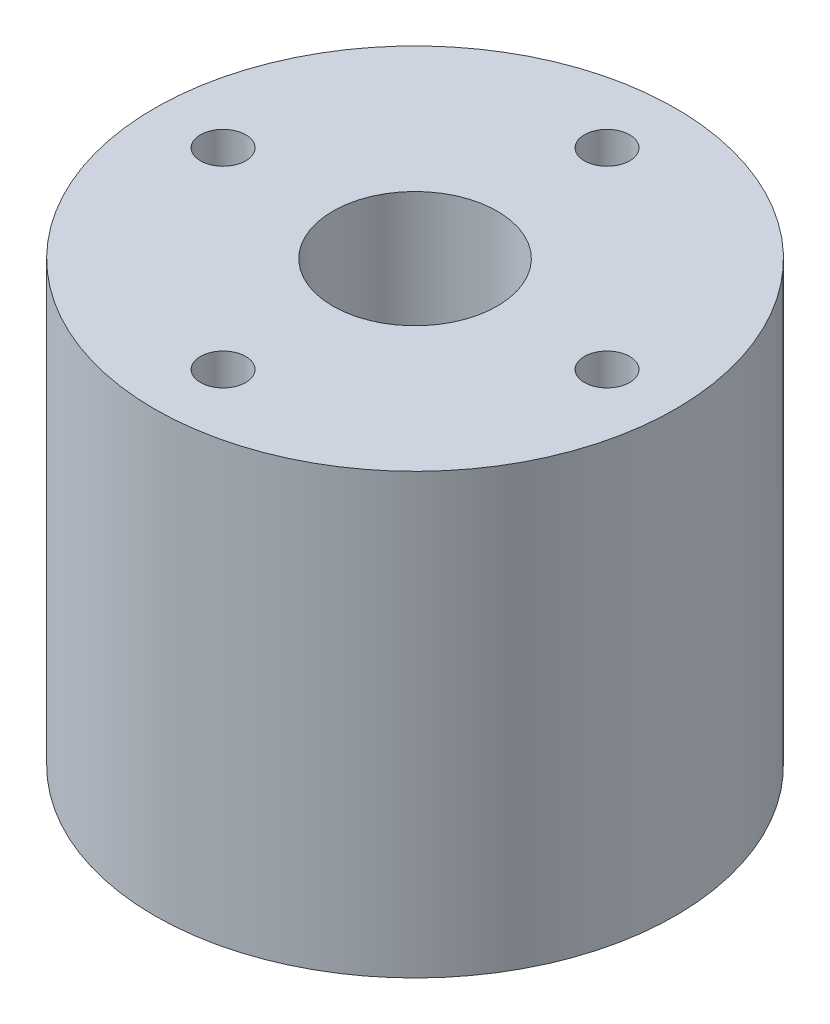
ISO-10303-21;
HEADER;
FILE_DESCRIPTION(('STEP AP214'),'2;1');
FILE_NAME('part.step','',(''),(''),'','','');
FILE_SCHEMA(('AUTOMOTIVE_DESIGN { 1 0 10303 214 1 1 1 1 }'));
ENDSEC;
DATA;
#1=APPLICATION_CONTEXT('core data for automotive mechanical design processes');
#2=APPLICATION_PROTOCOL_DEFINITION('international standard','automotive_design',2000,#1);
#3=PRODUCT_CONTEXT('',#1,'mechanical');
#4=PRODUCT('Part','Part','',(#3));
#5=PRODUCT_RELATED_PRODUCT_CATEGORY('part','',(#4));
#6=PRODUCT_DEFINITION_FORMATION('','',#4);
#7=PRODUCT_DEFINITION_CONTEXT('part definition',#1,'design');
#8=PRODUCT_DEFINITION('design','',#6,#7);
#9=PRODUCT_DEFINITION_SHAPE('','',#8);
#10=(LENGTH_UNIT() NAMED_UNIT(*) SI_UNIT(.MILLI.,.METRE.));
#11=(NAMED_UNIT(*) PLANE_ANGLE_UNIT() SI_UNIT($,.RADIAN.));
#12=(NAMED_UNIT(*) SI_UNIT($,.STERADIAN.) SOLID_ANGLE_UNIT());
#13=UNCERTAINTY_MEASURE_WITH_UNIT(LENGTH_MEASURE(1.E-05),#10,'distance_accuracy_value','');
#14=(GEOMETRIC_REPRESENTATION_CONTEXT(3) GLOBAL_UNCERTAINTY_ASSIGNED_CONTEXT((#13)) GLOBAL_UNIT_ASSIGNED_CONTEXT((#10,
#11,#12)) REPRESENTATION_CONTEXT('',''));
#15=CARTESIAN_POINT('',(0.,0.,0.));
#16=DIRECTION('',(0.,0.,1.));
#17=DIRECTION('',(1.,0.,0.));
#18=AXIS2_PLACEMENT_3D('',#15,#16,#17);
#19=CARTESIAN_POINT('',(0.,32.,0.));
#20=DIRECTION('',(0.,1.,0.));
#21=DIRECTION('',(0.,0.,1.));
#22=AXIS2_PLACEMENT_3D('',#19,#20,#21);
#23=PLANE('',#22);
#24=CARTESIAN_POINT('',(-14.,32.,0.));
#25=DIRECTION('',(0.,1.,0.));
#26=DIRECTION('',(0.,0.,1.));
#27=AXIS2_PLACEMENT_3D('',#24,#25,#26);
#28=CIRCLE('',#27,1.64999999999999);
#29=CARTESIAN_POINT('',(-14.,32.,1.64999999999999));
#30=VERTEX_POINT('',#29);
#31=EDGE_CURVE('E109',#30,#30,#28,.T.);
#32=ORIENTED_EDGE('',*,*,#31,.F.);
#33=EDGE_LOOP('',(#32));
#34=FACE_BOUND('',#33,.T.);
#35=CARTESIAN_POINT('',(0.,32.,14.));
#36=DIRECTION('',(0.,1.,0.));
#37=DIRECTION('',(0.,0.,1.));
#38=AXIS2_PLACEMENT_3D('',#35,#36,#37);
#39=CIRCLE('',#38,1.64999999999999);
#40=CARTESIAN_POINT('',(0.,32.,15.65));
#41=VERTEX_POINT('',#40);
#42=EDGE_CURVE('E115',#41,#41,#39,.T.);
#43=ORIENTED_EDGE('',*,*,#42,.F.);
#44=EDGE_LOOP('',(#43));
#45=FACE_BOUND('',#44,.T.);
#46=CARTESIAN_POINT('',(14.,32.,0.));
#47=DIRECTION('',(0.,1.,0.));
#48=DIRECTION('',(0.,0.,1.));
#49=AXIS2_PLACEMENT_3D('',#46,#47,#48);
#50=CIRCLE('',#49,1.64999999999999);
#51=CARTESIAN_POINT('',(14.,32.,1.64999999999999));
#52=VERTEX_POINT('',#51);
#53=EDGE_CURVE('E121',#52,#52,#50,.T.);
#54=ORIENTED_EDGE('',*,*,#53,.F.);
#55=EDGE_LOOP('',(#54));
#56=FACE_BOUND('',#55,.T.);
#57=CARTESIAN_POINT('',(0.,32.,-14.));
#58=DIRECTION('',(0.,1.,0.));
#59=DIRECTION('',(0.,0.,1.));
#60=AXIS2_PLACEMENT_3D('',#57,#58,#59);
#61=CIRCLE('',#60,1.64999999999999);
#62=CARTESIAN_POINT('',(0.,32.,-12.35));
#63=VERTEX_POINT('',#62);
#64=EDGE_CURVE('E127',#63,#63,#61,.T.);
#65=ORIENTED_EDGE('',*,*,#64,.F.);
#66=EDGE_LOOP('',(#65));
#67=FACE_BOUND('',#66,.T.);
#68=CARTESIAN_POINT('',(0.,32.,0.));
#69=DIRECTION('',(0.,1.,0.));
#70=DIRECTION('',(0.,0.,1.));
#71=AXIS2_PLACEMENT_3D('',#68,#69,#70);
#72=CIRCLE('',#71,19.);
#73=CARTESIAN_POINT('',(0.,32.,19.));
#74=VERTEX_POINT('',#73);
#75=EDGE_CURVE('E11',#74,#74,#72,.T.);
#76=ORIENTED_EDGE('',*,*,#75,.T.);
#77=EDGE_LOOP('',(#76));
#78=FACE_BOUND('',#77,.T.);
#79=CARTESIAN_POINT('',(0.,32.,0.));
#80=DIRECTION('',(0.,1.,0.));
#81=DIRECTION('',(0.,0.,1.));
#82=AXIS2_PLACEMENT_3D('',#79,#80,#81);
#83=CIRCLE('',#82,6.);
#84=CARTESIAN_POINT('',(0.,32.,6.));
#85=VERTEX_POINT('',#84);
#86=EDGE_CURVE('E139',#85,#85,#83,.T.);
#87=ORIENTED_EDGE('',*,*,#86,.F.);
#88=EDGE_LOOP('',(#87));
#89=FACE_BOUND('',#88,.T.);
#90=ADVANCED_FACE('F36',(#34,#45,#56,#67,#78,#89),#23,.T.);
#91=CARTESIAN_POINT('',(0.,0.,0.));
#92=DIRECTION('',(0.,1.,0.));
#93=DIRECTION('',(0.,0.,1.));
#94=AXIS2_PLACEMENT_3D('',#91,#92,#93);
#95=PLANE('',#94);
#96=CARTESIAN_POINT('',(0.,0.,14.));
#97=DIRECTION('',(0.,-1.,0.));
#98=DIRECTION('',(0.,0.,-1.));
#99=AXIS2_PLACEMENT_3D('',#96,#97,#98);
#100=CIRCLE('',#99,1.64999999999999);
#101=CARTESIAN_POINT('',(0.,0.,12.35));
#102=VERTEX_POINT('',#101);
#103=EDGE_CURVE('E87',#102,#102,#100,.T.);
#104=ORIENTED_EDGE('',*,*,#103,.F.);
#105=EDGE_LOOP('',(#104));
#106=FACE_BOUND('',#105,.T.);
#107=CARTESIAN_POINT('',(-14.,0.,0.));
#108=DIRECTION('',(0.,-1.,0.));
#109=DIRECTION('',(0.,0.,-1.));
#110=AXIS2_PLACEMENT_3D('',#107,#108,#109);
#111=CIRCLE('',#110,1.64999999999999);
#112=CARTESIAN_POINT('',(-14.,0.,-1.64999999999999));
#113=VERTEX_POINT('',#112);
#114=EDGE_CURVE('E86',#113,#113,#111,.T.);
#115=ORIENTED_EDGE('',*,*,#114,.F.);
#116=EDGE_LOOP('',(#115));
#117=FACE_BOUND('',#116,.T.);
#118=CARTESIAN_POINT('',(0.,0.,-14.));
#119=DIRECTION('',(0.,-1.,0.));
#120=DIRECTION('',(0.,0.,-1.));
#121=AXIS2_PLACEMENT_3D('',#118,#119,#120);
#122=CIRCLE('',#121,1.64999999999999);
#123=CARTESIAN_POINT('',(0.,0.,-15.65));
#124=VERTEX_POINT('',#123);
#125=EDGE_CURVE('E97',#124,#124,#122,.T.);
#126=ORIENTED_EDGE('',*,*,#125,.F.);
#127=EDGE_LOOP('',(#126));
#128=FACE_BOUND('',#127,.T.);
#129=CARTESIAN_POINT('',(14.,0.,0.));
#130=DIRECTION('',(0.,-1.,0.));
#131=DIRECTION('',(0.,0.,-1.));
#132=AXIS2_PLACEMENT_3D('',#129,#130,#131);
#133=CIRCLE('',#132,1.64999999999999);
#134=CARTESIAN_POINT('',(14.,0.,-1.64999999999999));
#135=VERTEX_POINT('',#134);
#136=EDGE_CURVE('E103',#135,#135,#133,.T.);
#137=ORIENTED_EDGE('',*,*,#136,.F.);
#138=EDGE_LOOP('',(#137));
#139=FACE_BOUND('',#138,.T.);
#140=CARTESIAN_POINT('',(0.,0.,0.));
#141=DIRECTION('',(0.,1.,0.));
#142=DIRECTION('',(0.,0.,1.));
#143=AXIS2_PLACEMENT_3D('',#140,#141,#142);
#144=CIRCLE('',#143,19.);
#145=CARTESIAN_POINT('',(0.,0.,19.));
#146=VERTEX_POINT('',#145);
#147=EDGE_CURVE('E50',#146,#146,#144,.T.);
#148=ORIENTED_EDGE('',*,*,#147,.F.);
#149=EDGE_LOOP('',(#148));
#150=FACE_BOUND('',#149,.T.);
#151=CARTESIAN_POINT('',(0.,0.,0.));
#152=DIRECTION('',(0.,1.,0.));
#153=DIRECTION('',(0.,0.,1.));
#154=AXIS2_PLACEMENT_3D('',#151,#152,#153);
#155=CIRCLE('',#154,6.);
#156=CARTESIAN_POINT('',(0.,0.,6.));
#157=VERTEX_POINT('',#156);
#158=EDGE_CURVE('E138',#157,#157,#155,.T.);
#159=ORIENTED_EDGE('',*,*,#158,.T.);
#160=EDGE_LOOP('',(#159));
#161=FACE_BOUND('',#160,.T.);
#162=ADVANCED_FACE('F155',(#106,#117,#128,#139,#150,#161),#95,.F.);
#163=CARTESIAN_POINT('',(0.,32.,0.));
#164=DIRECTION('',(0.,-1.,0.));
#165=DIRECTION('',(0.,0.,-1.));
#166=AXIS2_PLACEMENT_3D('',#163,#164,#165);
#167=CYLINDRICAL_SURFACE('',#166,19.);
#168=CARTESIAN_POINT('',(-19.,13.5,0.));
#169=CARTESIAN_POINT('',(-18.999997967774,13.5000058990539,-0.139778315489381));
#170=CARTESIAN_POINT('',(-18.9984412683557,13.5117623252415,-0.279642447495432));
#171=CARTESIAN_POINT('',(-18.9923810422329,13.5584729959637,-0.555474474016765));
#172=CARTESIAN_POINT('',(-18.9878744896332,13.5934510612745,-0.691438217949604));
#173=CARTESIAN_POINT('',(-18.9764219373405,13.685552940939,-0.955436642925264));
#174=CARTESIAN_POINT('',(-18.9694776299244,13.7426613953407,-1.08347675216936));
#175=CARTESIAN_POINT('',(-18.9539206812215,13.8773683454559,-1.32813277832855));
#176=CARTESIAN_POINT('',(-18.9453083126858,13.9549634920642,-1.44475055826477));
#177=CARTESIAN_POINT('',(-18.9273173646443,14.1289446188761,-1.66398308687909));
#178=CARTESIAN_POINT('',(-18.9179348817316,14.2254302604729,-1.76651843289981));
#179=CARTESIAN_POINT('',(-18.8994924119599,14.4342393526699,-1.95399133146887));
#180=CARTESIAN_POINT('',(-18.890432442053,14.5465636342564,-2.03892796010931));
#181=CARTESIAN_POINT('',(-18.8736225658863,14.7843821015058,-2.18909162338547));
#182=CARTESIAN_POINT('',(-18.8658776941045,14.9099240440535,-2.25424363629101));
#183=CARTESIAN_POINT('',(-18.8526269269547,15.1702866903311,-2.36250946256607));
#184=CARTESIAN_POINT('',(-18.8471209376663,15.3051070045593,-2.4056242004109));
#185=CARTESIAN_POINT('',(-18.8390089488849,15.5793722288224,-2.46834893112872));
#186=CARTESIAN_POINT('',(-18.8363863510935,15.7187858602935,-2.48809350572305));
#187=CARTESIAN_POINT('',(-18.8342874081065,15.9989705785463,-2.50393399543625));
#188=CARTESIAN_POINT('',(-18.8348109231579,16.1397416047539,-2.50003096100307));
#189=CARTESIAN_POINT('',(-18.8389298660036,16.4177040979445,-2.46879737750758));
#190=CARTESIAN_POINT('',(-18.8425058020086,16.5549125979368,-2.44161547626708));
#191=CARTESIAN_POINT('',(-18.852296258763,16.8228037627535,-2.3648278688215));
#192=CARTESIAN_POINT('',(-18.8585108382319,16.9534862822783,-2.31522166359117));
#193=CARTESIAN_POINT('',(-18.8729003199956,17.205075335156,-2.19483509097755));
#194=CARTESIAN_POINT('',(-18.8810811502029,17.3259507990106,-2.12399053069557));
#195=CARTESIAN_POINT('',(-18.8984768576706,17.5541539313008,-1.96318413435717));
#196=CARTESIAN_POINT('',(-18.9076917872934,17.6614809131136,-1.87322133002782));
#197=CARTESIAN_POINT('',(-18.9262039286229,17.8604029509214,-1.67591027855669));
#198=CARTESIAN_POINT('',(-18.9355012293485,17.9518710348812,-1.56843398279011));
#199=CARTESIAN_POINT('',(-18.9530645440151,18.1154888403406,-1.33958658891132));
#200=CARTESIAN_POINT('',(-18.9613305551191,18.187638508698,-1.21821545257772));
#201=CARTESIAN_POINT('',(-18.9759058695861,18.3105730868767,-0.964922757293816));
#202=CARTESIAN_POINT('',(-18.9822144030351,18.3613495930113,-0.832997072631038));
#203=CARTESIAN_POINT('',(-18.9921571388021,18.4399933434377,-0.562390331231886));
#204=CARTESIAN_POINT('',(-18.9957914799383,18.4678617769038,-0.423709625549348));
#205=CARTESIAN_POINT('',(-18.9999582136113,18.4997326846677,-0.144626841595051));
#206=CARTESIAN_POINT('',(-19.0005133278906,18.5039099819924,-0.00424505397900182));
#207=CARTESIAN_POINT('',(-18.9985205333266,18.4887420573463,0.275216665266615));
#208=CARTESIAN_POINT('',(-18.9959726978817,18.4693973917732,0.414296627611644));
#209=CARTESIAN_POINT('',(-18.9880744020358,18.4078799409678,0.686687509149988));
#210=CARTESIAN_POINT('',(-18.9827342327916,18.3657909610622,0.820017679004481));
#211=CARTESIAN_POINT('',(-18.9698488481686,18.2600670687767,1.07772769061604));
#212=CARTESIAN_POINT('',(-18.9623035506347,18.1964313536299,1.20210719868892));
#213=CARTESIAN_POINT('',(-18.9457917882835,18.0490005651835,1.43916303555311));
#214=CARTESIAN_POINT('',(-18.9368174879556,17.9650929421136,1.55176881159962));
#215=CARTESIAN_POINT('',(-18.9184749473973,17.7796587659336,1.76136182953435));
#216=CARTESIAN_POINT('',(-18.9091066897838,17.678131434746,1.85834838132062));
#217=CARTESIAN_POINT('',(-18.8909615049602,17.4595676741758,2.03457405133125));
#218=CARTESIAN_POINT('',(-18.882188695812,17.342437149013,2.11369695379329));
#219=CARTESIAN_POINT('',(-18.8662967388838,17.0964463235499,2.25114524350548));
#220=CARTESIAN_POINT('',(-18.8591775549807,16.9675862795633,2.30947108507654));
#221=CARTESIAN_POINT('',(-18.8474274353122,16.7021622447982,2.40348340588749));
#222=CARTESIAN_POINT('',(-18.8427894223098,16.5656214071414,2.43923433050313));
#223=CARTESIAN_POINT('',(-18.8365068588229,16.288409154438,2.48728896692712));
#224=CARTESIAN_POINT('',(-18.834862152745,16.1477379544758,2.49959389747029));
#225=CARTESIAN_POINT('',(-18.8347572836292,15.8674147820967,2.50038325713136));
#226=CARTESIAN_POINT('',(-18.8362727080523,15.727763298057,2.48905029281035));
#227=CARTESIAN_POINT('',(-18.8422647251657,15.4523689854997,2.44327339157394));
#228=CARTESIAN_POINT('',(-18.8467413170668,15.3166261559405,2.40882946081797));
#229=CARTESIAN_POINT('',(-18.8581434764999,15.0529330189044,2.31786734754336));
#230=CARTESIAN_POINT('',(-18.8650679582854,14.9249792860682,2.26135895042261));
#231=CARTESIAN_POINT('',(-18.8805873470396,14.6803402757612,2.12788991460024));
#232=CARTESIAN_POINT('',(-18.8891822838294,14.5636551995151,2.05092891076783));
#233=CARTESIAN_POINT('',(-18.9071536004537,14.3439335655702,1.87806508524071));
#234=CARTESIAN_POINT('',(-18.916535291463,14.2410043767245,1.78202633147283));
#235=CARTESIAN_POINT('',(-18.9349767535594,14.0526545562555,1.57401834863999));
#236=CARTESIAN_POINT('',(-18.9440364485309,13.9672380419352,1.46204538383397));
#237=CARTESIAN_POINT('',(-18.9608556769231,13.8160277609319,1.22480279057949));
#238=CARTESIAN_POINT('',(-18.9686095798624,13.7503180641756,1.09947920166897));
#239=CARTESIAN_POINT('',(-18.9818871351467,13.6409726989488,0.839540973043682));
#240=CARTESIAN_POINT('',(-18.9874131818538,13.5973133193318,0.70493649110172));
#241=CARTESIAN_POINT('',(-18.9942975150946,13.5436254737753,0.474714442967836));
#242=CARTESIAN_POINT('',(-18.9964253917168,13.5272897930275,0.380541684686489));
#243=CARTESIAN_POINT('',(-18.9992773223142,13.5054750874419,0.190925958585041));
#244=CARTESIAN_POINT('',(-19.0000013882199,13.4999959703379,0.0954830015668618));
#245=CARTESIAN_POINT('',(-19.,13.5,0.));
#246=B_SPLINE_CURVE_WITH_KNOTS('',3,(#168,#169,#170,#171,#172,#173,#174,#175,#176,#177,#178,
#179,#180,#181,#182,#183,#184,#185,#186,#187,#188,#189,#190,#191,#192,#193,#194,#195,#196,#197,
#198,#199,#200,#201,#202,#203,#204,#205,#206,#207,#208,#209,#210,#211,#212,#213,#214,#215,#216,
#217,#218,#219,#220,#221,#222,#223,#224,#225,#226,#227,#228,#229,#230,#231,#232,#233,#234,#235,
#236,#237,#238,#239,#240,#241,#242,#243,#244,#245),.UNSPECIFIED.,.T.,.F.,(4,2,2,2,2,2,2,2,2,2,2,
2,2,2,2,2,2,2,2,2,2,2,2,2,2,2,2,2,2,2,2,2,2,2,2,2,2,2,4),(0.,0.418986144750716,
0.838402751295033,1.25752877489171,1.67658632335899,2.09791737096997,2.51927053226661,
2.94220203521433,3.36511579450623,3.78558208482052,4.20602969778296,4.62381238038425,
5.04160436068185,5.46067207111287,5.87976101093416,6.30206422391834,6.72436859858558,
7.14683886382434,7.56928719694785,7.9886140774151,8.4079310391552,8.82571338706289,
9.24351130200045,9.66368440831751,10.0838760739927,10.5067272952287,10.9295692785286,
11.3511986374783,11.7728060793191,12.1911686022117,12.6095310136043,13.027708095279,
13.4458926429743,13.8671712161902,14.2885487204712,14.7116990687392,15.1343934209874,
15.4206065905889,15.7068173277526),.UNSPECIFIED.);
#247=CARTESIAN_POINT('',(-19.,13.5,0.));
#248=VERTEX_POINT('',#247);
#249=EDGE_CURVE('E133',#248,#248,#246,.T.);
#250=ORIENTED_EDGE('',*,*,#249,.T.);
#251=EDGE_LOOP('',(#250));
#252=FACE_BOUND('',#251,.T.);
#253=ORIENTED_EDGE('',*,*,#75,.F.);
#254=EDGE_LOOP('',(#253));
#255=FACE_BOUND('',#254,.T.);
#256=ORIENTED_EDGE('',*,*,#147,.T.);
#257=EDGE_LOOP('',(#256));
#258=FACE_BOUND('',#257,.T.);
#259=ADVANCED_FACE('F38',(#252,#255,#258),#167,.T.);
#260=CARTESIAN_POINT('',(0.,32.,0.));
#261=DIRECTION('',(0.,-1.,0.));
#262=DIRECTION('',(0.,0.,-1.));
#263=AXIS2_PLACEMENT_3D('',#260,#261,#262);
#264=CYLINDRICAL_SURFACE('',#263,6.);
#265=CARTESIAN_POINT('',(-5.45435605731786,16.,-2.5));
#266=CARTESIAN_POINT('',(-5.45435734054166,16.0667081831549,-2.49999850025921));
#267=CARTESIAN_POINT('',(-5.4555854329,16.1334347921685,-2.49732449538893));
#268=CARTESIAN_POINT('',(-5.460451257595,16.266386478403,-2.48666416485593));
#269=CARTESIAN_POINT('',(-5.46409042196574,16.3326112338951,-2.47867468210214));
#270=CARTESIAN_POINT('',(-5.47848490817198,16.5300518667706,-2.44679265931592));
#271=CARTESIAN_POINT('',(-5.49271671920564,16.6598368164295,-2.41498683408238));
#272=CARTESIAN_POINT('',(-5.52853615769555,16.9111547641313,-2.33180001337599));
#273=CARTESIAN_POINT('',(-5.55009376241033,17.0327190520916,-2.28049881438598));
#274=CARTESIAN_POINT('',(-5.59808356001864,17.265510176557,-2.16001268934738));
#275=CARTESIAN_POINT('',(-5.62451459938574,17.3767394499768,-2.09083199376537));
#276=CARTESIAN_POINT('',(-5.68111508149861,17.5926539820894,-1.93194778443699));
#277=CARTESIAN_POINT('',(-5.71141131571832,17.6966157970475,-1.84130648149063));
#278=CARTESIAN_POINT('',(-5.77128595332676,17.8883997651745,-1.64404334636732));
#279=CARTESIAN_POINT('',(-5.80086407614999,17.9762156955111,-1.53741538134829));
#280=CARTESIAN_POINT('',(-5.8575107455344,18.1368992555286,-1.30552678905514));
#281=CARTESIAN_POINT('',(-5.88441479600862,18.2089533078815,-1.17965858775786));
#282=CARTESIAN_POINT('',(-5.93113040336416,18.3305519892175,-0.916264044334339));
#283=CARTESIAN_POINT('',(-5.95094510785638,18.3801066103974,-0.778742909642265));
#284=CARTESIAN_POINT('',(-5.98035041998162,18.4526789303404,-0.503536996147009));
#285=CARTESIAN_POINT('',(-5.99041942231785,18.4769433932332,-0.36623315241801));
#286=CARTESIAN_POINT('',(-6.00093657245546,18.502275278892,-0.0891583607041741));
#287=CARTESIAN_POINT('',(-6.00138862268061,18.5033521108742,0.0506115635357659));
#288=CARTESIAN_POINT('',(-5.99290258260449,18.4829314389708,0.319585560218813));
#289=CARTESIAN_POINT('',(-5.98453429295767,18.4628037991731,0.448914977212893));
#290=CARTESIAN_POINT('',(-5.96013033502178,18.4028937944991,0.702165787864647));
#291=CARTESIAN_POINT('',(-5.94409410149732,18.3631099806788,0.826086782110447));
#292=CARTESIAN_POINT('',(-5.90559704827471,18.2645439182725,1.06727623615443));
#293=CARTESIAN_POINT('',(-5.88304194251414,18.2054810742758,1.18441435414909));
#294=CARTESIAN_POINT('',(-5.83371427980366,18.0703084865819,1.40742353456466));
#295=CARTESIAN_POINT('',(-5.80694023334947,17.9941927183021,1.51329059551624));
#296=CARTESIAN_POINT('',(-5.74963397551513,17.8208351591992,1.7186818234134));
#297=CARTESIAN_POINT('',(-5.71896988702082,17.722482417457,1.81723287462318));
#298=CARTESIAN_POINT('',(-5.65875721372882,17.5105771185719,1.99686282986464));
#299=CARTESIAN_POINT('',(-5.62920906299901,17.3970187233643,2.0779349916834));
#300=CARTESIAN_POINT('',(-5.57363224672088,17.1532099267203,2.22280378497075));
#301=CARTESIAN_POINT('',(-5.54775116967603,17.0225335886945,2.28594506698397));
#302=CARTESIAN_POINT('',(-5.50419688296718,16.7510379102374,2.38892864103959));
#303=CARTESIAN_POINT('',(-5.48651780631503,16.6102259035158,2.42878759251237));
#304=CARTESIAN_POINT('',(-5.46282425074792,16.332206382133,2.48160050339178));
#305=CARTESIAN_POINT('',(-5.45612738403682,16.1953577554715,2.49613229266517));
#306=CARTESIAN_POINT('',(-5.45320573611839,15.9210430351874,2.50251261037213));
#307=CARTESIAN_POINT('',(-5.45697733196185,15.7835771716193,2.49436898636095));
#308=CARTESIAN_POINT('',(-5.47386262693795,15.5212032291366,2.45706955131303));
#309=CARTESIAN_POINT('',(-5.48636276033852,15.3960546264258,2.42929237636148));
#310=CARTESIAN_POINT('',(-5.51851260594277,15.1522974070048,2.355341171284));
#311=CARTESIAN_POINT('',(-5.53816398920152,15.0336903263384,2.30916284106237));
#312=CARTESIAN_POINT('',(-5.58341595714177,14.8007693792872,2.19755041610386));
#313=CARTESIAN_POINT('',(-5.60923324404617,14.6868500507806,2.13138366612393));
#314=CARTESIAN_POINT('',(-5.66360007481535,14.4711838950007,1.98240156877197));
#315=CARTESIAN_POINT('',(-5.69215079841133,14.3694423665913,1.89957901575222));
#316=CARTESIAN_POINT('',(-5.75157239569102,14.1723997302374,1.71168891143074));
#317=CARTESIAN_POINT('',(-5.78244293417774,14.0782972001197,1.6053593229584));
#318=CARTESIAN_POINT('',(-5.84086722367755,13.9090554160204,1.37770302510815));
#319=CARTESIAN_POINT('',(-5.868420731537,13.8339175517941,1.25637521761135));
#320=CARTESIAN_POINT('',(-5.91728503171628,13.7048202491916,1.00130936160272));
#321=CARTESIAN_POINT('',(-5.93857966278875,13.6509155177152,0.867540339261894));
#322=CARTESIAN_POINT('',(-5.9723634620551,13.5667664150372,0.591717670323944));
#323=CARTESIAN_POINT('',(-5.98485787035282,13.536507962451,0.449669008506773));
#324=CARTESIAN_POINT('',(-5.9990306959926,13.5022837499796,0.17203306696038));
#325=CARTESIAN_POINT('',(-6.0014040908376,13.4966280042899,0.0366881693984319));
#326=CARTESIAN_POINT('',(-5.99699046946599,13.5072262789047,-0.23297362323924));
#327=CARTESIAN_POINT('',(-5.99020505911644,13.523476458314,-0.367290694377479));
#328=CARTESIAN_POINT('',(-5.96860132018429,13.5762121575427,-0.626172965578199));
#329=CARTESIAN_POINT('',(-5.9540764862017,13.6119594094758,-0.750915078182087));
#330=CARTESIAN_POINT('',(-5.91858999492374,13.7018684458724,-0.99258445850724));
#331=CARTESIAN_POINT('',(-5.8976271149635,13.7560337283582,-1.1095102366691));
#332=CARTESIAN_POINT('',(-5.85011651583377,13.8839792475792,-1.33804914068053));
#333=CARTESIAN_POINT('',(-5.82335921372399,13.9585353235131,-1.44918335299799));
#334=CARTESIAN_POINT('',(-5.7674312075248,14.1240136448107,-1.65783731421916));
#335=CARTESIAN_POINT('',(-5.73825960968076,14.2149419658361,-1.75535198504112));
#336=CARTESIAN_POINT('',(-5.67829702479813,14.4178925300721,-1.9408997224229));
#337=CARTESIAN_POINT('',(-5.64753091772368,14.53092911203,-2.02783607699356));
#338=CARTESIAN_POINT('',(-5.5899105903639,14.7709063920007,-2.18166607575476));
#339=CARTESIAN_POINT('',(-5.56305856115973,14.8978548086674,-2.24854851583746));
#340=CARTESIAN_POINT('',(-5.51685287460303,15.1619289333595,-2.35965744264203));
#341=CARTESIAN_POINT('',(-5.49745949216625,15.2989959551496,-2.40400437258696));
#342=CARTESIAN_POINT('',(-5.47594959049764,15.5091637690664,-2.45239925350778));
#343=CARTESIAN_POINT('',(-5.47004503557757,15.5799105979561,-2.46550603347808));
#344=CARTESIAN_POINT('',(-5.46095373466208,15.7224260564186,-2.48558130943928));
#345=CARTESIAN_POINT('',(-5.45776506941946,15.7941939279226,-2.49255414024397));
#346=CARTESIAN_POINT('',(-5.45490391727668,15.910711605639,-2.49880479670823));
#347=CARTESIAN_POINT('',(-5.45435519844583,15.9553516756734,-2.50000100378859));
#348=CARTESIAN_POINT('',(-5.45435605731786,16.,-2.5));
#349=B_SPLINE_CURVE_WITH_KNOTS('',3,(#265,#266,#267,#268,#269,#270,#271,#272,#273,#274,#275,
#276,#277,#278,#279,#280,#281,#282,#283,#284,#285,#286,#287,#288,#289,#290,#291,#292,#293,#294,
#295,#296,#297,#298,#299,#300,#301,#302,#303,#304,#305,#306,#307,#308,#309,#310,#311,#312,#313,
#314,#315,#316,#317,#318,#319,#320,#321,#322,#323,#324,#325,#326,#327,#328,#329,#330,#331,#332,
#333,#334,#335,#336,#337,#338,#339,#340,#341,#342,#343,#344,#345,#346,#347,#348),.UNSPECIFIED.,
.T.,.F.,(4,2,2,2,2,2,2,2,2,2,2,2,2,2,2,2,2,2,2,2,2,2,2,2,2,2,2,2,2,2,2,2,2,2,2,2,2,2,2,2,2,4),
(0.,0.200084575093049,0.400288095243586,0.801278994956904,1.20064597557677,1.59991854837275,
2.02172149988562,2.44368668047076,2.88395420283103,3.32402600677038,3.7411967908316,
4.15819828963116,4.54982147617441,4.94147353531023,5.33910096407387,5.73686909172223,
6.16267530816224,6.58864548009989,7.02861558463919,7.46827048625634,7.87940023747111,
8.29038772171393,8.6750626926688,9.05982760961556,9.46088720770835,9.86212068725427,
10.2960179260552,10.7299469521823,11.1649867904569,11.5997673642051,12.004157373226,
12.4084764873833,12.7984529720747,13.1885035639884,13.5961819279257,14.0040118923231,
14.4395932095167,14.8754174341574,15.3088871873109,15.5252058174741,15.7413714538654,
15.8752896716763),.UNSPECIFIED.);
#350=CARTESIAN_POINT('',(-5.45435605731786,16.,-2.5));
#351=VERTEX_POINT('',#350);
#352=EDGE_CURVE('E41',#351,#351,#349,.T.);
#353=ORIENTED_EDGE('',*,*,#352,.F.);
#354=EDGE_LOOP('',(#353));
#355=FACE_BOUND('',#354,.T.);
#356=ORIENTED_EDGE('',*,*,#86,.T.);
#357=EDGE_LOOP('',(#356));
#358=FACE_BOUND('',#357,.T.);
#359=ORIENTED_EDGE('',*,*,#158,.F.);
#360=EDGE_LOOP('',(#359));
#361=FACE_BOUND('',#360,.T.);
#362=ADVANCED_FACE('F146',(#355,#358,#361),#264,.F.);
#363=CARTESIAN_POINT('',(-19.,16.,0.));
#364=DIRECTION('',(1.,0.,0.));
#365=DIRECTION('',(0.,0.,-1.));
#366=AXIS2_PLACEMENT_3D('',#363,#364,#365);
#367=CYLINDRICAL_SURFACE('',#366,2.5);
#368=ORIENTED_EDGE('',*,*,#352,.T.);
#369=EDGE_LOOP('',(#368));
#370=FACE_BOUND('',#369,.T.);
#371=ORIENTED_EDGE('',*,*,#249,.F.);
#372=EDGE_LOOP('',(#371));
#373=FACE_BOUND('',#372,.T.);
#374=ADVANCED_FACE('F141',(#370,#373),#367,.F.);
#375=CARTESIAN_POINT('',(0.,21.9,-14.));
#376=DIRECTION('',(0.,1.,0.));
#377=DIRECTION('',(0.,0.,1.));
#378=AXIS2_PLACEMENT_3D('',#375,#376,#377);
#379=CONICAL_SURFACE('',#378,1.64999999999999,1.02974425867665);
#380=CARTESIAN_POINT('',(0.,20.9085799786045,-14.));
#381=VERTEX_POINT('',#380);
#382=VERTEX_LOOP('',#381);
#383=FACE_BOUND('',#382,.T.);
#384=CARTESIAN_POINT('',(0.,21.9,-14.));
#385=DIRECTION('',(0.,1.,0.));
#386=DIRECTION('',(0.,0.,1.));
#387=AXIS2_PLACEMENT_3D('',#384,#385,#386);
#388=CIRCLE('',#387,1.64999999999999);
#389=CARTESIAN_POINT('',(0.,21.9,-12.35));
#390=VERTEX_POINT('',#389);
#391=EDGE_CURVE('E130',#390,#390,#388,.T.);
#392=ORIENTED_EDGE('',*,*,#391,.T.);
#393=EDGE_LOOP('',(#392));
#394=FACE_BOUND('',#393,.T.);
#395=ADVANCED_FACE('F145',(#383,#394),#379,.F.);
#396=CARTESIAN_POINT('',(0.,32.,-14.));
#397=DIRECTION('',(0.,1.,0.));
#398=DIRECTION('',(0.,0.,1.));
#399=AXIS2_PLACEMENT_3D('',#396,#397,#398);
#400=CYLINDRICAL_SURFACE('',#399,1.64999999999999);
#401=ORIENTED_EDGE('',*,*,#391,.F.);
#402=EDGE_LOOP('',(#401));
#403=FACE_BOUND('',#402,.T.);
#404=ORIENTED_EDGE('',*,*,#64,.T.);
#405=EDGE_LOOP('',(#404));
#406=FACE_BOUND('',#405,.T.);
#407=ADVANCED_FACE('F225',(#403,#406),#400,.F.);
#408=CARTESIAN_POINT('',(14.,21.9,0.));
#409=DIRECTION('',(0.,1.,0.));
#410=DIRECTION('',(0.,0.,1.));
#411=AXIS2_PLACEMENT_3D('',#408,#409,#410);
#412=CONICAL_SURFACE('',#411,1.64999999999999,1.02974425867665);
#413=CARTESIAN_POINT('',(14.,20.9085799786045,0.));
#414=VERTEX_POINT('',#413);
#415=VERTEX_LOOP('',#414);
#416=FACE_BOUND('',#415,.T.);
#417=CARTESIAN_POINT('',(14.,21.9,0.));
#418=DIRECTION('',(0.,1.,0.));
#419=DIRECTION('',(0.,0.,1.));
#420=AXIS2_PLACEMENT_3D('',#417,#418,#419);
#421=CIRCLE('',#420,1.64999999999999);
#422=CARTESIAN_POINT('',(14.,21.9,1.64999999999999));
#423=VERTEX_POINT('',#422);
#424=EDGE_CURVE('E124',#423,#423,#421,.T.);
#425=ORIENTED_EDGE('',*,*,#424,.T.);
#426=EDGE_LOOP('',(#425));
#427=FACE_BOUND('',#426,.T.);
#428=ADVANCED_FACE('F222',(#416,#427),#412,.F.);
#429=CARTESIAN_POINT('',(14.,32.,0.));
#430=DIRECTION('',(0.,1.,0.));
#431=DIRECTION('',(0.,0.,1.));
#432=AXIS2_PLACEMENT_3D('',#429,#430,#431);
#433=CYLINDRICAL_SURFACE('',#432,1.64999999999999);
#434=ORIENTED_EDGE('',*,*,#424,.F.);
#435=EDGE_LOOP('',(#434));
#436=FACE_BOUND('',#435,.T.);
#437=ORIENTED_EDGE('',*,*,#53,.T.);
#438=EDGE_LOOP('',(#437));
#439=FACE_BOUND('',#438,.T.);
#440=ADVANCED_FACE('F218',(#436,#439),#433,.F.);
#441=CARTESIAN_POINT('',(0.,21.9,14.));
#442=DIRECTION('',(0.,1.,0.));
#443=DIRECTION('',(0.,0.,1.));
#444=AXIS2_PLACEMENT_3D('',#441,#442,#443);
#445=CONICAL_SURFACE('',#444,1.64999999999999,1.02974425867665);
#446=CARTESIAN_POINT('',(0.,20.9085799786045,14.));
#447=VERTEX_POINT('',#446);
#448=VERTEX_LOOP('',#447);
#449=FACE_BOUND('',#448,.T.);
#450=CARTESIAN_POINT('',(0.,21.9,14.));
#451=DIRECTION('',(0.,1.,0.));
#452=DIRECTION('',(0.,0.,1.));
#453=AXIS2_PLACEMENT_3D('',#450,#451,#452);
#454=CIRCLE('',#453,1.64999999999999);
#455=CARTESIAN_POINT('',(0.,21.9,15.65));
#456=VERTEX_POINT('',#455);
#457=EDGE_CURVE('E118',#456,#456,#454,.T.);
#458=ORIENTED_EDGE('',*,*,#457,.T.);
#459=EDGE_LOOP('',(#458));
#460=FACE_BOUND('',#459,.T.);
#461=ADVANCED_FACE('F214',(#449,#460),#445,.F.);
#462=CARTESIAN_POINT('',(0.,32.,14.));
#463=DIRECTION('',(0.,1.,0.));
#464=DIRECTION('',(0.,0.,1.));
#465=AXIS2_PLACEMENT_3D('',#462,#463,#464);
#466=CYLINDRICAL_SURFACE('',#465,1.64999999999999);
#467=ORIENTED_EDGE('',*,*,#457,.F.);
#468=EDGE_LOOP('',(#467));
#469=FACE_BOUND('',#468,.T.);
#470=ORIENTED_EDGE('',*,*,#42,.T.);
#471=EDGE_LOOP('',(#470));
#472=FACE_BOUND('',#471,.T.);
#473=ADVANCED_FACE('F210',(#469,#472),#466,.F.);
#474=CARTESIAN_POINT('',(-14.,21.9,0.));
#475=DIRECTION('',(0.,1.,0.));
#476=DIRECTION('',(0.,0.,1.));
#477=AXIS2_PLACEMENT_3D('',#474,#475,#476);
#478=CONICAL_SURFACE('',#477,1.64999999999999,1.02974425867665);
#479=CARTESIAN_POINT('',(-14.,20.9085799786045,0.));
#480=VERTEX_POINT('',#479);
#481=VERTEX_LOOP('',#480);
#482=FACE_BOUND('',#481,.T.);
#483=CARTESIAN_POINT('',(-14.,21.9,0.));
#484=DIRECTION('',(0.,1.,0.));
#485=DIRECTION('',(0.,0.,1.));
#486=AXIS2_PLACEMENT_3D('',#483,#484,#485);
#487=CIRCLE('',#486,1.64999999999999);
#488=CARTESIAN_POINT('',(-14.,21.9,1.64999999999999));
#489=VERTEX_POINT('',#488);
#490=EDGE_CURVE('E112',#489,#489,#487,.T.);
#491=ORIENTED_EDGE('',*,*,#490,.T.);
#492=EDGE_LOOP('',(#491));
#493=FACE_BOUND('',#492,.T.);
#494=ADVANCED_FACE('F206',(#482,#493),#478,.F.);
#495=CARTESIAN_POINT('',(-14.,32.,0.));
#496=DIRECTION('',(0.,1.,0.));
#497=DIRECTION('',(0.,0.,1.));
#498=AXIS2_PLACEMENT_3D('',#495,#496,#497);
#499=CYLINDRICAL_SURFACE('',#498,1.64999999999999);
#500=ORIENTED_EDGE('',*,*,#490,.F.);
#501=EDGE_LOOP('',(#500));
#502=FACE_BOUND('',#501,.T.);
#503=ORIENTED_EDGE('',*,*,#31,.T.);
#504=EDGE_LOOP('',(#503));
#505=FACE_BOUND('',#504,.T.);
#506=ADVANCED_FACE('F198',(#502,#505),#499,.F.);
#507=CARTESIAN_POINT('',(14.,10.1,0.));
#508=DIRECTION('',(0.,-1.,0.));
#509=DIRECTION('',(0.,0.,-1.));
#510=AXIS2_PLACEMENT_3D('',#507,#508,#509);
#511=CONICAL_SURFACE('',#510,1.64999999999999,1.02974425867665);
#512=CARTESIAN_POINT('',(14.,11.0914200213955,0.));
#513=VERTEX_POINT('',#512);
#514=VERTEX_LOOP('',#513);
#515=FACE_BOUND('',#514,.T.);
#516=CARTESIAN_POINT('',(14.,10.1,0.));
#517=DIRECTION('',(0.,-1.,0.));
#518=DIRECTION('',(0.,0.,-1.));
#519=AXIS2_PLACEMENT_3D('',#516,#517,#518);
#520=CIRCLE('',#519,1.64999999999999);
#521=CARTESIAN_POINT('',(14.,10.1,-1.64999999999999));
#522=VERTEX_POINT('',#521);
#523=EDGE_CURVE('E106',#522,#522,#520,.T.);
#524=ORIENTED_EDGE('',*,*,#523,.T.);
#525=EDGE_LOOP('',(#524));
#526=FACE_BOUND('',#525,.T.);
#527=ADVANCED_FACE('F188',(#515,#526),#511,.F.);
#528=CARTESIAN_POINT('',(14.,0.,0.));
#529=DIRECTION('',(0.,-1.,0.));
#530=DIRECTION('',(0.,0.,-1.));
#531=AXIS2_PLACEMENT_3D('',#528,#529,#530);
#532=CYLINDRICAL_SURFACE('',#531,1.64999999999999);
#533=ORIENTED_EDGE('',*,*,#523,.F.);
#534=EDGE_LOOP('',(#533));
#535=FACE_BOUND('',#534,.T.);
#536=ORIENTED_EDGE('',*,*,#136,.T.);
#537=EDGE_LOOP('',(#536));
#538=FACE_BOUND('',#537,.T.);
#539=ADVANCED_FACE('F185',(#535,#538),#532,.F.);
#540=CARTESIAN_POINT('',(0.,10.1,-14.));
#541=DIRECTION('',(0.,-1.,0.));
#542=DIRECTION('',(0.,0.,-1.));
#543=AXIS2_PLACEMENT_3D('',#540,#541,#542);
#544=CONICAL_SURFACE('',#543,1.64999999999999,1.02974425867665);
#545=CARTESIAN_POINT('',(0.,11.0914200213955,-14.));
#546=VERTEX_POINT('',#545);
#547=VERTEX_LOOP('',#546);
#548=FACE_BOUND('',#547,.T.);
#549=CARTESIAN_POINT('',(0.,10.1,-14.));
#550=DIRECTION('',(0.,-1.,0.));
#551=DIRECTION('',(0.,0.,-1.));
#552=AXIS2_PLACEMENT_3D('',#549,#550,#551);
#553=CIRCLE('',#552,1.64999999999999);
#554=CARTESIAN_POINT('',(0.,10.1,-15.65));
#555=VERTEX_POINT('',#554);
#556=EDGE_CURVE('E100',#555,#555,#553,.T.);
#557=ORIENTED_EDGE('',*,*,#556,.T.);
#558=EDGE_LOOP('',(#557));
#559=FACE_BOUND('',#558,.T.);
#560=ADVANCED_FACE('F187',(#548,#559),#544,.F.);
#561=CARTESIAN_POINT('',(0.,0.,-14.));
#562=DIRECTION('',(0.,-1.,0.));
#563=DIRECTION('',(0.,0.,-1.));
#564=AXIS2_PLACEMENT_3D('',#561,#562,#563);
#565=CYLINDRICAL_SURFACE('',#564,1.64999999999999);
#566=ORIENTED_EDGE('',*,*,#556,.F.);
#567=EDGE_LOOP('',(#566));
#568=FACE_BOUND('',#567,.T.);
#569=ORIENTED_EDGE('',*,*,#125,.T.);
#570=EDGE_LOOP('',(#569));
#571=FACE_BOUND('',#570,.T.);
#572=ADVANCED_FACE('F195',(#568,#571),#565,.F.);
#573=CARTESIAN_POINT('',(-14.,10.1,0.));
#574=DIRECTION('',(0.,-1.,0.));
#575=DIRECTION('',(0.,0.,-1.));
#576=AXIS2_PLACEMENT_3D('',#573,#574,#575);
#577=CONICAL_SURFACE('',#576,1.64999999999999,1.02974425867665);
#578=CARTESIAN_POINT('',(-14.,11.0914200213955,0.));
#579=VERTEX_POINT('',#578);
#580=VERTEX_LOOP('',#579);
#581=FACE_BOUND('',#580,.T.);
#582=CARTESIAN_POINT('',(-14.,10.1,0.));
#583=DIRECTION('',(0.,-1.,0.));
#584=DIRECTION('',(0.,0.,-1.));
#585=AXIS2_PLACEMENT_3D('',#582,#583,#584);
#586=CIRCLE('',#585,1.64999999999999);
#587=CARTESIAN_POINT('',(-14.,10.1,-1.64999999999999));
#588=VERTEX_POINT('',#587);
#589=EDGE_CURVE('E90',#588,#588,#586,.T.);
#590=ORIENTED_EDGE('',*,*,#589,.T.);
#591=EDGE_LOOP('',(#590));
#592=FACE_BOUND('',#591,.T.);
#593=ADVANCED_FACE('F330',(#581,#592),#577,.F.);
#594=CARTESIAN_POINT('',(-14.,0.,0.));
#595=DIRECTION('',(0.,-1.,0.));
#596=DIRECTION('',(0.,0.,-1.));
#597=AXIS2_PLACEMENT_3D('',#594,#595,#596);
#598=CYLINDRICAL_SURFACE('',#597,1.64999999999999);
#599=ORIENTED_EDGE('',*,*,#589,.F.);
#600=EDGE_LOOP('',(#599));
#601=FACE_BOUND('',#600,.T.);
#602=ORIENTED_EDGE('',*,*,#114,.T.);
#603=EDGE_LOOP('',(#602));
#604=FACE_BOUND('',#603,.T.);
#605=ADVANCED_FACE('F80',(#601,#604),#598,.F.);
#606=CARTESIAN_POINT('',(0.,10.1,14.));
#607=DIRECTION('',(0.,-1.,0.));
#608=DIRECTION('',(0.,0.,-1.));
#609=AXIS2_PLACEMENT_3D('',#606,#607,#608);
#610=CONICAL_SURFACE('',#609,1.64999999999999,1.02974425867665);
#611=CARTESIAN_POINT('',(0.,11.0914200213955,14.));
#612=VERTEX_POINT('',#611);
#613=VERTEX_LOOP('',#612);
#614=FACE_BOUND('',#613,.T.);
#615=CARTESIAN_POINT('',(0.,10.1,14.));
#616=DIRECTION('',(0.,-1.,0.));
#617=DIRECTION('',(0.,0.,-1.));
#618=AXIS2_PLACEMENT_3D('',#615,#616,#617);
#619=CIRCLE('',#618,1.64999999999999);
#620=CARTESIAN_POINT('',(0.,10.1,12.35));
#621=VERTEX_POINT('',#620);
#622=EDGE_CURVE('E84',#621,#621,#619,.T.);
#623=ORIENTED_EDGE('',*,*,#622,.T.);
#624=EDGE_LOOP('',(#623));
#625=FACE_BOUND('',#624,.T.);
#626=ADVANCED_FACE('F76',(#614,#625),#610,.F.);
#627=CARTESIAN_POINT('',(0.,0.,14.));
#628=DIRECTION('',(0.,-1.,0.));
#629=DIRECTION('',(0.,0.,-1.));
#630=AXIS2_PLACEMENT_3D('',#627,#628,#629);
#631=CYLINDRICAL_SURFACE('',#630,1.64999999999999);
#632=ORIENTED_EDGE('',*,*,#622,.F.);
#633=EDGE_LOOP('',(#632));
#634=FACE_BOUND('',#633,.T.);
#635=ORIENTED_EDGE('',*,*,#103,.T.);
#636=EDGE_LOOP('',(#635));
#637=FACE_BOUND('',#636,.T.);
#638=ADVANCED_FACE('F79',(#634,#637),#631,.F.);
#639=CLOSED_SHELL('',(#90,#162,#259,#362,#374,#395,#407,#428,#440,#461,#473,#494,#506,#527,#539,
#560,#572,#593,#605,#626,#638));
#640=MANIFOLD_SOLID_BREP('B2',#639);
#641=ADVANCED_BREP_SHAPE_REPRESENTATION('',(#18,#640),#14);
#642=SHAPE_DEFINITION_REPRESENTATION(#9,#641);
ENDSEC;
END-ISO-10303-21;
